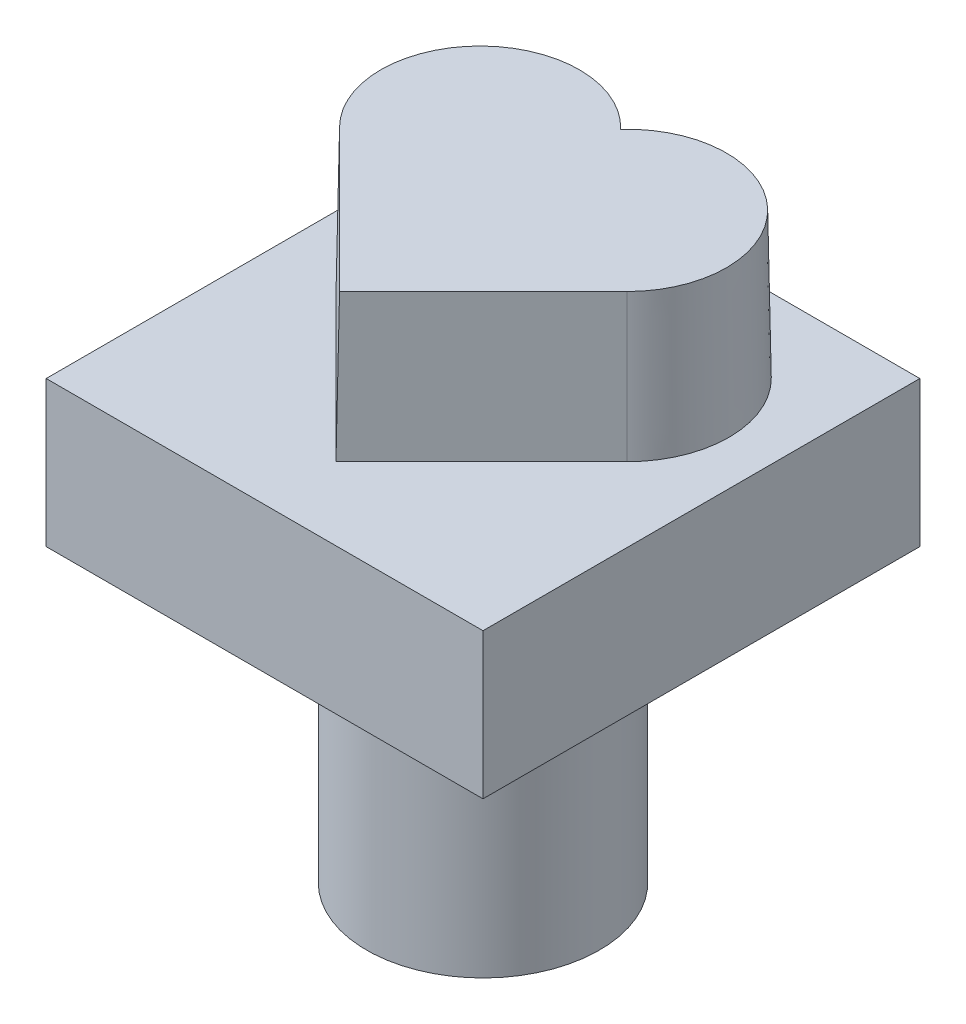
ISO-10303-21;
HEADER;
FILE_DESCRIPTION(('STEP AP214'),'2;1');
FILE_NAME('part.step','',(''),(''),'','','');
FILE_SCHEMA(('AUTOMOTIVE_DESIGN { 1 0 10303 214 1 1 1 1 }'));
ENDSEC;
DATA;
#1=APPLICATION_CONTEXT('core data for automotive mechanical design processes');
#2=APPLICATION_PROTOCOL_DEFINITION('international standard','automotive_design',2000,#1);
#3=PRODUCT_CONTEXT('',#1,'mechanical');
#4=PRODUCT('Part','Part','',(#3));
#5=PRODUCT_RELATED_PRODUCT_CATEGORY('part','',(#4));
#6=PRODUCT_DEFINITION_FORMATION('','',#4);
#7=PRODUCT_DEFINITION_CONTEXT('part definition',#1,'design');
#8=PRODUCT_DEFINITION('design','',#6,#7);
#9=PRODUCT_DEFINITION_SHAPE('','',#8);
#10=(LENGTH_UNIT() NAMED_UNIT(*) SI_UNIT(.MILLI.,.METRE.));
#11=(NAMED_UNIT(*) PLANE_ANGLE_UNIT() SI_UNIT($,.RADIAN.));
#12=(NAMED_UNIT(*) SI_UNIT($,.STERADIAN.) SOLID_ANGLE_UNIT());
#13=UNCERTAINTY_MEASURE_WITH_UNIT(LENGTH_MEASURE(1.E-05),#10,'distance_accuracy_value','');
#14=(GEOMETRIC_REPRESENTATION_CONTEXT(3) GLOBAL_UNCERTAINTY_ASSIGNED_CONTEXT((#13)) GLOBAL_UNIT_ASSIGNED_CONTEXT((#10,
#11,#12)) REPRESENTATION_CONTEXT('',''));
#15=CARTESIAN_POINT('',(0.,0.,0.));
#16=DIRECTION('',(0.,0.,1.));
#17=DIRECTION('',(1.,0.,0.));
#18=AXIS2_PLACEMENT_3D('',#15,#16,#17);
#19=CARTESIAN_POINT('',(-7.5,5.,7.5));
#20=DIRECTION('',(1.,0.,0.));
#21=DIRECTION('',(0.,0.,-1.));
#22=AXIS2_PLACEMENT_3D('',#19,#20,#21);
#23=PLANE('',#22);
#24=DIRECTION('',(0.,0.,1.));
#25=VECTOR('',#24,1.);
#26=CARTESIAN_POINT('',(-7.5,0.,7.5));
#27=LINE('',#26,#25);
#28=CARTESIAN_POINT('',(-7.5,0.,-7.5));
#29=VERTEX_POINT('',#28);
#30=CARTESIAN_POINT('',(-7.5,0.,7.5));
#31=VERTEX_POINT('',#30);
#32=EDGE_CURVE('E120',#29,#31,#27,.T.);
#33=ORIENTED_EDGE('',*,*,#32,.T.);
#34=DIRECTION('',(0.,-1.,0.));
#35=VECTOR('',#34,1.);
#36=CARTESIAN_POINT('',(-7.5,5.,7.5));
#37=LINE('',#36,#35);
#38=CARTESIAN_POINT('',(-7.5,5.,7.5));
#39=VERTEX_POINT('',#38);
#40=EDGE_CURVE('E40',#39,#31,#37,.T.);
#41=ORIENTED_EDGE('',*,*,#40,.F.);
#42=DIRECTION('',(0.,0.,1.));
#43=VECTOR('',#42,1.);
#44=CARTESIAN_POINT('',(-7.5,5.,7.5));
#45=LINE('',#44,#43);
#46=CARTESIAN_POINT('',(-7.5,5.,-7.5));
#47=VERTEX_POINT('',#46);
#48=EDGE_CURVE('E134',#47,#39,#45,.T.);
#49=ORIENTED_EDGE('',*,*,#48,.F.);
#50=DIRECTION('',(0.,-1.,0.));
#51=VECTOR('',#50,1.);
#52=CARTESIAN_POINT('',(-7.5,5.,-7.5));
#53=LINE('',#52,#51);
#54=EDGE_CURVE('E144',#47,#29,#53,.T.);
#55=ORIENTED_EDGE('',*,*,#54,.T.);
#56=EDGE_LOOP('',(#33,#41,#49,#55));
#57=FACE_BOUND('',#56,.T.);
#58=ADVANCED_FACE('F37',(#57),#23,.F.);
#59=CARTESIAN_POINT('',(7.5,5.,7.5));
#60=DIRECTION('',(0.,0.,-1.));
#61=DIRECTION('',(-1.,0.,0.));
#62=AXIS2_PLACEMENT_3D('',#59,#60,#61);
#63=PLANE('',#62);
#64=DIRECTION('',(1.,0.,0.));
#65=VECTOR('',#64,1.);
#66=CARTESIAN_POINT('',(7.5,0.,7.5));
#67=LINE('',#66,#65);
#68=CARTESIAN_POINT('',(7.5,0.,7.5));
#69=VERTEX_POINT('',#68);
#70=EDGE_CURVE('E147',#31,#69,#67,.T.);
#71=ORIENTED_EDGE('',*,*,#70,.T.);
#72=DIRECTION('',(0.,-1.,0.));
#73=VECTOR('',#72,1.);
#74=CARTESIAN_POINT('',(7.5,5.,7.5));
#75=LINE('',#74,#73);
#76=CARTESIAN_POINT('',(7.5,5.,7.5));
#77=VERTEX_POINT('',#76);
#78=EDGE_CURVE('E156',#77,#69,#75,.T.);
#79=ORIENTED_EDGE('',*,*,#78,.F.);
#80=DIRECTION('',(1.,0.,0.));
#81=VECTOR('',#80,1.);
#82=CARTESIAN_POINT('',(7.5,5.,7.5));
#83=LINE('',#82,#81);
#84=EDGE_CURVE('E137',#39,#77,#83,.T.);
#85=ORIENTED_EDGE('',*,*,#84,.F.);
#86=ORIENTED_EDGE('',*,*,#40,.T.);
#87=EDGE_LOOP('',(#71,#79,#85,#86));
#88=FACE_BOUND('',#87,.T.);
#89=ADVANCED_FACE('F165',(#88),#63,.F.);
#90=CARTESIAN_POINT('',(7.5,5.,7.5));
#91=DIRECTION('',(-1.,0.,0.));
#92=DIRECTION('',(0.,0.,1.));
#93=AXIS2_PLACEMENT_3D('',#90,#91,#92);
#94=PLANE('',#93);
#95=DIRECTION('',(0.,0.,-1.));
#96=VECTOR('',#95,1.);
#97=CARTESIAN_POINT('',(7.5,0.,7.5));
#98=LINE('',#97,#96);
#99=CARTESIAN_POINT('',(7.5,0.,-7.5));
#100=VERTEX_POINT('',#99);
#101=EDGE_CURVE('E149',#69,#100,#98,.T.);
#102=ORIENTED_EDGE('',*,*,#101,.T.);
#103=DIRECTION('',(0.,-1.,0.));
#104=VECTOR('',#103,1.);
#105=CARTESIAN_POINT('',(7.5,5.,-7.5));
#106=LINE('',#105,#104);
#107=CARTESIAN_POINT('',(7.5,5.,-7.5));
#108=VERTEX_POINT('',#107);
#109=EDGE_CURVE('E154',#108,#100,#106,.T.);
#110=ORIENTED_EDGE('',*,*,#109,.F.);
#111=DIRECTION('',(0.,0.,-1.));
#112=VECTOR('',#111,1.);
#113=CARTESIAN_POINT('',(7.5,5.,7.5));
#114=LINE('',#113,#112);
#115=EDGE_CURVE('E140',#77,#108,#114,.T.);
#116=ORIENTED_EDGE('',*,*,#115,.F.);
#117=ORIENTED_EDGE('',*,*,#78,.T.);
#118=EDGE_LOOP('',(#102,#110,#116,#117));
#119=FACE_BOUND('',#118,.T.);
#120=ADVANCED_FACE('F174',(#119),#94,.F.);
#121=CARTESIAN_POINT('',(7.5,5.,-7.5));
#122=DIRECTION('',(0.,0.,1.));
#123=DIRECTION('',(1.,0.,0.));
#124=AXIS2_PLACEMENT_3D('',#121,#122,#123);
#125=PLANE('',#124);
#126=DIRECTION('',(-1.,0.,0.));
#127=VECTOR('',#126,1.);
#128=CARTESIAN_POINT('',(7.5,0.,-7.5));
#129=LINE('',#128,#127);
#130=EDGE_CURVE('E138',#100,#29,#129,.T.);
#131=ORIENTED_EDGE('',*,*,#130,.T.);
#132=ORIENTED_EDGE('',*,*,#54,.F.);
#133=DIRECTION('',(-1.,0.,0.));
#134=VECTOR('',#133,1.);
#135=CARTESIAN_POINT('',(7.5,5.,-7.5));
#136=LINE('',#135,#134);
#137=EDGE_CURVE('E142',#108,#47,#136,.T.);
#138=ORIENTED_EDGE('',*,*,#137,.F.);
#139=ORIENTED_EDGE('',*,*,#109,.T.);
#140=EDGE_LOOP('',(#131,#132,#138,#139));
#141=FACE_BOUND('',#140,.T.);
#142=ADVANCED_FACE('F177',(#141),#125,.F.);
#143=CARTESIAN_POINT('',(0.,5.,0.));
#144=DIRECTION('',(0.,1.,0.));
#145=DIRECTION('',(0.,0.,1.));
#146=AXIS2_PLACEMENT_3D('',#143,#144,#145);
#147=PLANE('',#146);
#148=CARTESIAN_POINT('',(2.47487373415292,5.,-2.47487373415292));
#149=DIRECTION('',(0.,1.,0.));
#150=DIRECTION('',(0.,0.,1.));
#151=AXIS2_PLACEMENT_3D('',#148,#149,#150);
#152=CIRCLE('',#151,3.5);
#153=CARTESIAN_POINT('',(4.94974746830583,5.,0.));
#154=VERTEX_POINT('',#153);
#155=CARTESIAN_POINT('',(-0.0492474805474244,5.,-4.89949991018494));
#156=VERTEX_POINT('',#155);
#157=EDGE_CURVE('E52',#154,#156,#152,.T.);
#158=ORIENTED_EDGE('',*,*,#157,.F.);
#159=DIRECTION('',(0.707106781186547,0.,-0.707106781186548));
#160=VECTOR('',#159,1.);
#161=CARTESIAN_POINT('',(-0.0497474677877645,5.,4.9994949360936));
#162=LINE('',#161,#160);
#163=CARTESIAN_POINT('',(-0.0497474677877645,5.,4.9994949360936));
#164=VERTEX_POINT('',#163);
#165=EDGE_CURVE('E56',#164,#154,#162,.T.);
#166=ORIENTED_EDGE('',*,*,#165,.F.);
#167=DIRECTION('',(0.707106781186547,0.,0.707106781186548));
#168=VECTOR('',#167,1.);
#169=CARTESIAN_POINT('',(-4.99950001275966,5.,0.0497423911217034));
#170=LINE('',#169,#168);
#171=CARTESIAN_POINT('',(-4.99950001275966,5.,0.0497423911217029));
#172=VERTEX_POINT('',#171);
#173=EDGE_CURVE('E97',#172,#164,#170,.T.);
#174=ORIENTED_EDGE('',*,*,#173,.F.);
#175=CARTESIAN_POINT('',(-2.52462627860674,5.,-2.42513134303121));
#176=DIRECTION('',(0.,1.,0.));
#177=DIRECTION('',(0.,0.,1.));
#178=AXIS2_PLACEMENT_3D('',#175,#176,#177);
#179=CIRCLE('',#178,3.5);
#180=EDGE_CURVE('E101',#156,#172,#179,.T.);
#181=ORIENTED_EDGE('',*,*,#180,.F.);
#182=EDGE_LOOP('',(#158,#166,#174,#181));
#183=FACE_BOUND('',#182,.T.);
#184=ORIENTED_EDGE('',*,*,#48,.T.);
#185=ORIENTED_EDGE('',*,*,#84,.T.);
#186=ORIENTED_EDGE('',*,*,#115,.T.);
#187=ORIENTED_EDGE('',*,*,#137,.T.);
#188=EDGE_LOOP('',(#184,#185,#186,#187));
#189=FACE_BOUND('',#188,.T.);
#190=ADVANCED_FACE('F99',(#183,#189),#147,.T.);
#191=CARTESIAN_POINT('',(0.,0.,0.));
#192=DIRECTION('',(0.,1.,0.));
#193=DIRECTION('',(0.,0.,1.));
#194=AXIS2_PLACEMENT_3D('',#191,#192,#193);
#195=PLANE('',#194);
#196=CARTESIAN_POINT('',(0.,0.,0.));
#197=DIRECTION('',(0.,-1.,0.));
#198=DIRECTION('',(0.,0.,-1.));
#199=AXIS2_PLACEMENT_3D('',#196,#197,#198);
#200=CIRCLE('',#199,4.);
#201=CARTESIAN_POINT('',(0.,0.,-4.));
#202=VERTEX_POINT('',#201);
#203=EDGE_CURVE('E11',#202,#202,#200,.T.);
#204=ORIENTED_EDGE('',*,*,#203,.F.);
#205=EDGE_LOOP('',(#204));
#206=FACE_BOUND('',#205,.T.);
#207=ORIENTED_EDGE('',*,*,#32,.F.);
#208=ORIENTED_EDGE('',*,*,#130,.F.);
#209=ORIENTED_EDGE('',*,*,#101,.F.);
#210=ORIENTED_EDGE('',*,*,#70,.F.);
#211=EDGE_LOOP('',(#207,#208,#209,#210));
#212=FACE_BOUND('',#211,.T.);
#213=ADVANCED_FACE('F172',(#206,#212),#195,.F.);
#214=CARTESIAN_POINT('',(2.47487373415292,5.,-2.47487373415292));
#215=DIRECTION('',(0.,-1.,0.));
#216=DIRECTION('',(0.,0.,1.));
#217=AXIS2_PLACEMENT_3D('',#214,#215,#216);
#218=CONICAL_SURFACE('',#217,3.5,0.0174532925199433);
#219=ORIENTED_EDGE('',*,*,#157,.T.);
#220=CARTESIAN_POINT('',(-0.0479898787104193,10.,-4.77310107292814));
#221=CARTESIAN_POINT('',(-0.0482023817417681,9.16667404236087,-4.79445929242628));
#222=CARTESIAN_POINT('',(-0.0484134334105663,8.33334439671341,-4.81567163861744));
#223=CARTESIAN_POINT('',(-0.0488326340228992,6.66667773004674,-4.85780458436949));
#224=CARTESIAN_POINT('',(-0.0490407829664362,5.83334070902753,-4.8787251839306));
#225=CARTESIAN_POINT('',(-0.0492474805474249,5.,-4.89949991018496));
#226=B_SPLINE_CURVE_WITH_KNOTS('',3,(#220,#221,#222,#223,#224,#225),.UNSPECIFIED.,.F.,.F.,(4,2,
4),(0.,2.5007988240556,5.00159764617592),.UNSPECIFIED.);
#227=CARTESIAN_POINT('',(-0.0479898787104193,10.,-4.77310107292814));
#228=VERTEX_POINT('',#227);
#229=EDGE_CURVE('E114',#228,#156,#226,.T.);
#230=ORIENTED_EDGE('',*,*,#229,.F.);
#231=CARTESIAN_POINT('',(2.47487373415292,10.,-2.47487373415292));
#232=DIRECTION('',(0.,1.,0.));
#233=DIRECTION('',(0.,0.,1.));
#234=AXIS2_PLACEMENT_3D('',#231,#232,#233);
#235=CIRCLE('',#234,3.41272467535891);
#236=CARTESIAN_POINT('',(4.88803449442186,10.,-0.0617129738839721));
#237=VERTEX_POINT('',#236);
#238=EDGE_CURVE('E126',#237,#228,#235,.T.);
#239=ORIENTED_EDGE('',*,*,#238,.F.);
#240=DIRECTION('',(0.012340714939827,-0.999847695156391,0.012340714939827));
#241=VECTOR('',#240,1.);
#242=CARTESIAN_POINT('',(4.94974746830583,5.,0.));
#243=LINE('',#242,#241);
#244=EDGE_CURVE('E122',#237,#154,#243,.T.);
#245=ORIENTED_EDGE('',*,*,#244,.T.);
#246=EDGE_LOOP('',(#219,#230,#239,#245));
#247=FACE_BOUND('',#246,.T.);
#248=ADVANCED_FACE('F184',(#247),#218,.T.);
#249=CARTESIAN_POINT('',(-2.52462627860674,5.,-2.42513134303121));
#250=DIRECTION('',(0.,-1.,0.));
#251=DIRECTION('',(0.,0.,1.));
#252=AXIS2_PLACEMENT_3D('',#249,#250,#251);
#253=CONICAL_SURFACE('',#252,3.5,0.0174532925199433);
#254=ORIENTED_EDGE('',*,*,#180,.T.);
#255=DIRECTION('',(-0.012340714939827,-0.999847695156391,0.012340714939827));
#256=VECTOR('',#255,1.);
#257=CARTESIAN_POINT('',(-4.99950001275966,5.,0.0497423911217026));
#258=LINE('',#257,#256);
#259=CARTESIAN_POINT('',(-4.93778703887569,10.,-0.0119705827622682));
#260=VERTEX_POINT('',#259);
#261=EDGE_CURVE('E111',#260,#172,#258,.T.);
#262=ORIENTED_EDGE('',*,*,#261,.F.);
#263=CARTESIAN_POINT('',(-2.52462627860674,10.,-2.42513134303121));
#264=DIRECTION('',(0.,1.,0.));
#265=DIRECTION('',(0.,0.,1.));
#266=AXIS2_PLACEMENT_3D('',#263,#264,#265);
#267=CIRCLE('',#266,3.41272467535891);
#268=EDGE_CURVE('E129',#228,#260,#267,.T.);
#269=ORIENTED_EDGE('',*,*,#268,.F.);
#270=ORIENTED_EDGE('',*,*,#229,.T.);
#271=EDGE_LOOP('',(#254,#262,#269,#270));
#272=FACE_BOUND('',#271,.T.);
#273=ADVANCED_FACE('F110',(#272),#253,.T.);
#274=CARTESIAN_POINT('',(-4.99950001275966,5.,0.0497423911217034));
#275=DIRECTION('',(-0.706999085398824,0.0174524064372835,0.706999085398824));
#276=DIRECTION('',(0.707106781186548,0.,0.707106781186548));
#277=AXIS2_PLACEMENT_3D('',#274,#275,#276);
#278=PLANE('',#277);
#279=ORIENTED_EDGE('',*,*,#173,.T.);
#280=DIRECTION('',(0.,-0.999695459881887,0.024677671923046));
#281=VECTOR('',#280,1.);
#282=CARTESIAN_POINT('',(-0.0497474677877645,5.,4.9994949360936));
#283=LINE('',#282,#281);
#284=CARTESIAN_POINT('',(-0.0497474677877637,10.,4.87606898832566));
#285=VERTEX_POINT('',#284);
#286=EDGE_CURVE('E118',#285,#164,#283,.T.);
#287=ORIENTED_EDGE('',*,*,#286,.F.);
#288=DIRECTION('',(-0.707106781186548,0.,-0.707106781186548));
#289=VECTOR('',#288,1.);
#290=CARTESIAN_POINT('',(-4.93778703887569,10.,-0.0119705827622674));
#291=LINE('',#290,#289);
#292=EDGE_CURVE('E117',#260,#285,#291,.F.);
#293=ORIENTED_EDGE('',*,*,#292,.F.);
#294=ORIENTED_EDGE('',*,*,#261,.T.);
#295=EDGE_LOOP('',(#279,#287,#293,#294));
#296=FACE_BOUND('',#295,.T.);
#297=ADVANCED_FACE('F116',(#296),#278,.T.);
#298=CARTESIAN_POINT('',(-0.0497474677877645,5.,4.9994949360936));
#299=DIRECTION('',(0.706999085398825,0.0174524064372835,0.706999085398824));
#300=DIRECTION('',(0.707106781186547,0.,-0.707106781186548));
#301=AXIS2_PLACEMENT_3D('',#298,#299,#300);
#302=PLANE('',#301);
#303=ORIENTED_EDGE('',*,*,#165,.T.);
#304=ORIENTED_EDGE('',*,*,#244,.F.);
#305=DIRECTION('',(-0.707106781186547,0.,0.707106781186548));
#306=VECTOR('',#305,1.);
#307=CARTESIAN_POINT('',(-0.111460441671735,10.,4.93778196220963));
#308=LINE('',#307,#306);
#309=EDGE_CURVE('E132',#285,#237,#308,.F.);
#310=ORIENTED_EDGE('',*,*,#309,.F.);
#311=ORIENTED_EDGE('',*,*,#286,.T.);
#312=EDGE_LOOP('',(#303,#304,#310,#311));
#313=FACE_BOUND('',#312,.T.);
#314=ADVANCED_FACE('F238',(#313),#302,.T.);
#315=CARTESIAN_POINT('',(2.47487373415292,10.,-2.47487373415292));
#316=DIRECTION('',(0.,1.,0.));
#317=DIRECTION('',(0.,0.,1.));
#318=AXIS2_PLACEMENT_3D('',#315,#316,#317);
#319=PLANE('',#318);
#320=ORIENTED_EDGE('',*,*,#238,.T.);
#321=ORIENTED_EDGE('',*,*,#268,.T.);
#322=ORIENTED_EDGE('',*,*,#292,.T.);
#323=ORIENTED_EDGE('',*,*,#309,.T.);
#324=EDGE_LOOP('',(#320,#321,#322,#323));
#325=FACE_BOUND('',#324,.T.);
#326=ADVANCED_FACE('F247',(#325),#319,.T.);
#327=CARTESIAN_POINT('',(0.,-10.,0.));
#328=DIRECTION('',(0.,1.,0.));
#329=DIRECTION('',(0.,0.,1.));
#330=AXIS2_PLACEMENT_3D('',#327,#328,#329);
#331=CYLINDRICAL_SURFACE('',#330,4.);
#332=CARTESIAN_POINT('',(0.,-10.,0.));
#333=DIRECTION('',(0.,-1.,0.));
#334=DIRECTION('',(0.,0.,-1.));
#335=AXIS2_PLACEMENT_3D('',#332,#333,#334);
#336=CIRCLE('',#335,4.);
#337=CARTESIAN_POINT('',(0.,-10.,-4.));
#338=VERTEX_POINT('',#337);
#339=EDGE_CURVE('E329',#338,#338,#336,.T.);
#340=ORIENTED_EDGE('',*,*,#339,.F.);
#341=EDGE_LOOP('',(#340));
#342=FACE_BOUND('',#341,.T.);
#343=ORIENTED_EDGE('',*,*,#203,.T.);
#344=EDGE_LOOP('',(#343));
#345=FACE_BOUND('',#344,.T.);
#346=ADVANCED_FACE('F258',(#342,#345),#331,.T.);
#347=CARTESIAN_POINT('',(0.,-10.,0.));
#348=DIRECTION('',(0.,-1.,0.));
#349=DIRECTION('',(0.,0.,-1.));
#350=AXIS2_PLACEMENT_3D('',#347,#348,#349);
#351=PLANE('',#350);
#352=ORIENTED_EDGE('',*,*,#339,.T.);
#353=EDGE_LOOP('',(#352));
#354=FACE_BOUND('',#353,.T.);
#355=ADVANCED_FACE('F275',(#354),#351,.T.);
#356=CLOSED_SHELL('',(#58,#89,#120,#142,#190,#213,#248,#273,#297,#314,#326,#346,#355));
#357=MANIFOLD_SOLID_BREP('B2',#356);
#358=ADVANCED_BREP_SHAPE_REPRESENTATION('',(#18,#357),#14);
#359=SHAPE_DEFINITION_REPRESENTATION(#9,#358);
ENDSEC;
END-ISO-10303-21;
